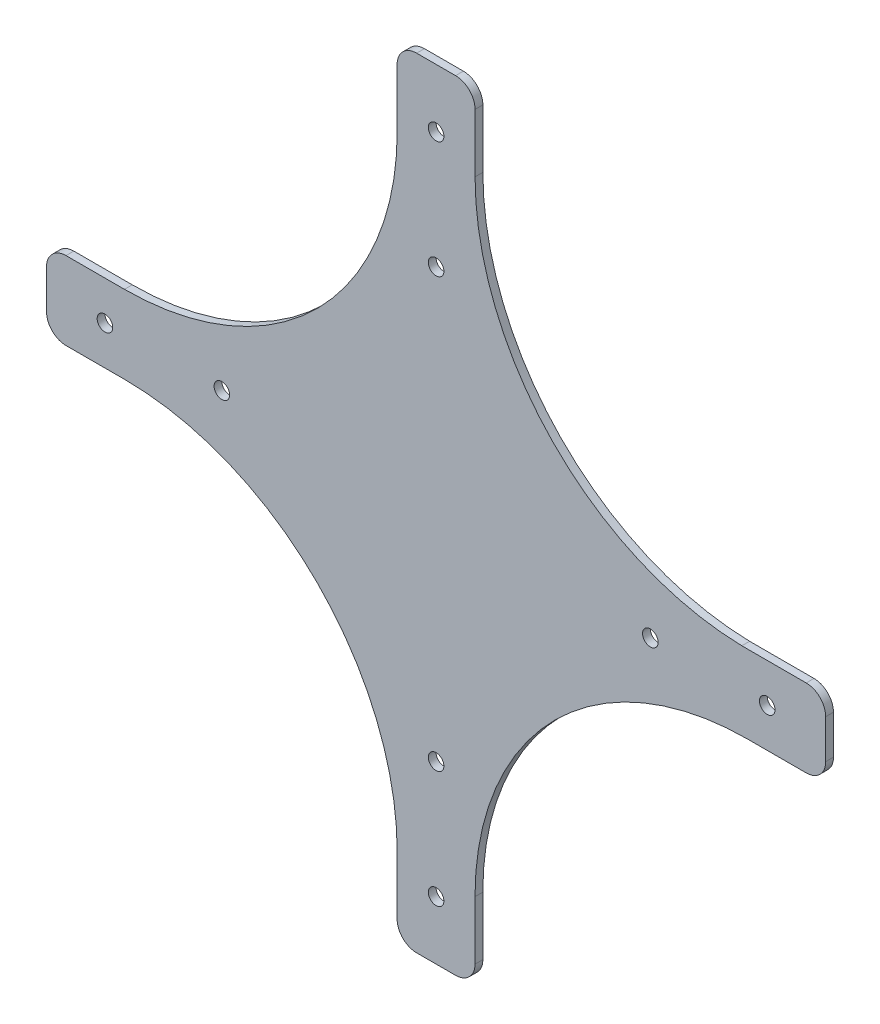
ISO-10303-21;
HEADER;
FILE_DESCRIPTION(('STEP AP214'),'2;1');
FILE_NAME('part.step','',(''),(''),'','','');
FILE_SCHEMA(('AUTOMOTIVE_DESIGN { 1 0 10303 214 1 1 1 1 }'));
ENDSEC;
DATA;
#1=APPLICATION_CONTEXT('core data for automotive mechanical design processes');
#2=APPLICATION_PROTOCOL_DEFINITION('international standard','automotive_design',2000,#1);
#3=PRODUCT_CONTEXT('',#1,'mechanical');
#4=PRODUCT('Part','Part','',(#3));
#5=PRODUCT_RELATED_PRODUCT_CATEGORY('part','',(#4));
#6=PRODUCT_DEFINITION_FORMATION('','',#4);
#7=PRODUCT_DEFINITION_CONTEXT('part definition',#1,'design');
#8=PRODUCT_DEFINITION('design','',#6,#7);
#9=PRODUCT_DEFINITION_SHAPE('','',#8);
#10=(LENGTH_UNIT() NAMED_UNIT(*) SI_UNIT(.MILLI.,.METRE.));
#11=(NAMED_UNIT(*) PLANE_ANGLE_UNIT() SI_UNIT($,.RADIAN.));
#12=(NAMED_UNIT(*) SI_UNIT($,.STERADIAN.) SOLID_ANGLE_UNIT());
#13=UNCERTAINTY_MEASURE_WITH_UNIT(LENGTH_MEASURE(1.E-05),#10,'distance_accuracy_value','');
#14=(GEOMETRIC_REPRESENTATION_CONTEXT(3) GLOBAL_UNCERTAINTY_ASSIGNED_CONTEXT((#13)) GLOBAL_UNIT_ASSIGNED_CONTEXT((#10,
#11,#12)) REPRESENTATION_CONTEXT('',''));
#15=CARTESIAN_POINT('',(0.,0.,0.));
#16=DIRECTION('',(0.,0.,1.));
#17=DIRECTION('',(1.,0.,0.));
#18=AXIS2_PLACEMENT_3D('',#15,#16,#17);
#19=CARTESIAN_POINT('',(-1.11472575882883E-12,-133.874093655514,2.));
#20=DIRECTION('',(0.,-1.,0.));
#21=DIRECTION('',(1.,0.,0.));
#22=AXIS2_PLACEMENT_3D('',#19,#20,#21);
#23=PLANE('',#22);
#24=DIRECTION('',(-1.,0.,0.));
#25=VECTOR('',#24,1.);
#26=CARTESIAN_POINT('',(-1.11472575882883E-12,-133.874093655514,0.));
#27=LINE('',#26,#25);
#28=CARTESIAN_POINT('',(74.5986729088794,-133.874093655515,0.));
#29=VERTEX_POINT('',#28);
#30=CARTESIAN_POINT('',(64.5986729088795,-133.874093655514,0.));
#31=VERTEX_POINT('',#30);
#32=EDGE_CURVE('E253',#29,#31,#27,.T.);
#33=ORIENTED_EDGE('',*,*,#32,.F.);
#34=DIRECTION('',(0.,0.,-1.));
#35=VECTOR('',#34,1.);
#36=CARTESIAN_POINT('',(74.5986729088794,-133.874093655515,2.));
#37=LINE('',#36,#35);
#38=CARTESIAN_POINT('',(74.5986729088794,-133.874093655515,2.));
#39=VERTEX_POINT('',#38);
#40=EDGE_CURVE('E11',#39,#29,#37,.T.);
#41=ORIENTED_EDGE('',*,*,#40,.F.);
#42=DIRECTION('',(-1.,0.,0.));
#43=VECTOR('',#42,1.);
#44=CARTESIAN_POINT('',(-1.11472575882883E-12,-133.874093655514,2.));
#45=LINE('',#44,#43);
#46=CARTESIAN_POINT('',(64.5986729088795,-133.874093655514,2.));
#47=VERTEX_POINT('',#46);
#48=EDGE_CURVE('E387',#39,#47,#45,.T.);
#49=ORIENTED_EDGE('',*,*,#48,.T.);
#50=DIRECTION('',(0.,0.,-1.));
#51=VECTOR('',#50,1.);
#52=CARTESIAN_POINT('',(64.5986729088795,-133.874093655514,2.));
#53=LINE('',#52,#51);
#54=EDGE_CURVE('E135',#47,#31,#53,.T.);
#55=ORIENTED_EDGE('',*,*,#54,.T.);
#56=EDGE_LOOP('',(#33,#41,#49,#55));
#57=FACE_BOUND('',#56,.T.);
#58=ADVANCED_FACE('F35',(#57),#23,.T.);
#59=CARTESIAN_POINT('',(74.5986729088795,-128.874093655515,2.));
#60=DIRECTION('',(0.,0.,-1.));
#61=DIRECTION('',(-1.,0.,0.));
#62=AXIS2_PLACEMENT_3D('',#59,#60,#61);
#63=CYLINDRICAL_SURFACE('',#62,4.99999999999999);
#64=CARTESIAN_POINT('',(74.5986729088795,-128.874093655515,0.));
#65=DIRECTION('',(0.,0.,1.));
#66=DIRECTION('',(1.,0.,0.));
#67=AXIS2_PLACEMENT_3D('',#64,#65,#66);
#68=CIRCLE('',#67,4.99999999999999);
#69=CARTESIAN_POINT('',(79.5986729088795,-128.874093655515,0.));
#70=VERTEX_POINT('',#69);
#71=EDGE_CURVE('E255',#29,#70,#68,.T.);
#72=ORIENTED_EDGE('',*,*,#71,.T.);
#73=DIRECTION('',(0.,0.,-1.));
#74=VECTOR('',#73,1.);
#75=CARTESIAN_POINT('',(79.5986729088795,-128.874093655515,2.));
#76=LINE('',#75,#74);
#77=CARTESIAN_POINT('',(79.5986729088795,-128.874093655515,2.));
#78=VERTEX_POINT('',#77);
#79=EDGE_CURVE('E44',#78,#70,#76,.T.);
#80=ORIENTED_EDGE('',*,*,#79,.F.);
#81=CARTESIAN_POINT('',(74.5986729088795,-128.874093655515,2.));
#82=DIRECTION('',(0.,0.,1.));
#83=DIRECTION('',(1.,0.,0.));
#84=AXIS2_PLACEMENT_3D('',#81,#82,#83);
#85=CIRCLE('',#84,4.99999999999999);
#86=EDGE_CURVE('E383',#39,#78,#85,.T.);
#87=ORIENTED_EDGE('',*,*,#86,.F.);
#88=ORIENTED_EDGE('',*,*,#40,.T.);
#89=EDGE_LOOP('',(#72,#80,#87,#88));
#90=FACE_BOUND('',#89,.T.);
#91=ADVANCED_FACE('F372',(#90),#63,.T.);
#92=CARTESIAN_POINT('',(79.4524198975907,0.0901037334350843,2.));
#93=DIRECTION('',(0.99999935695569,0.00113405829061631,0.));
#94=DIRECTION('',(-0.00113405829061631,0.99999935695569,0.));
#95=AXIS2_PLACEMENT_3D('',#92,#93,#94);
#96=PLANE('',#95);
#97=DIRECTION('',(0.00113405829061631,-0.99999935695569,0.));
#98=VECTOR('',#97,1.);
#99=CARTESIAN_POINT('',(79.4524198975907,0.0901037334350843,0.));
#100=LINE('',#99,#98);
#101=CARTESIAN_POINT('',(79.5816812930767,-113.891085271318,0.));
#102=VERTEX_POINT('',#101);
#103=EDGE_CURVE('E258',#102,#70,#100,.T.);
#104=ORIENTED_EDGE('',*,*,#103,.F.);
#105=DIRECTION('',(0.,0.,-1.));
#106=VECTOR('',#105,1.);
#107=CARTESIAN_POINT('',(79.5816812930767,-113.891085271318,2.));
#108=LINE('',#107,#106);
#109=CARTESIAN_POINT('',(79.5816812930767,-113.891085271318,2.));
#110=VERTEX_POINT('',#109);
#111=EDGE_CURVE('E362',#110,#102,#108,.T.);
#112=ORIENTED_EDGE('',*,*,#111,.F.);
#113=DIRECTION('',(0.00113405829061631,-0.99999935695569,0.));
#114=VECTOR('',#113,1.);
#115=CARTESIAN_POINT('',(79.4524198975907,0.0901037334350843,2.));
#116=LINE('',#115,#114);
#117=EDGE_CURVE('E369',#110,#78,#116,.T.);
#118=ORIENTED_EDGE('',*,*,#117,.T.);
#119=ORIENTED_EDGE('',*,*,#79,.T.);
#120=EDGE_LOOP('',(#104,#112,#118,#119));
#121=FACE_BOUND('',#120,.T.);
#122=ADVANCED_FACE('F367',(#121),#96,.T.);
#123=CARTESIAN_POINT('',(149.581681293077,-113.891085271318,2.));
#124=DIRECTION('',(0.,0.,-1.));
#125=DIRECTION('',(-1.,0.,0.));
#126=AXIS2_PLACEMENT_3D('',#123,#124,#125);
#127=CYLINDRICAL_SURFACE('',#126,70.);
#128=CARTESIAN_POINT('',(149.581681293077,-113.891085271318,0.));
#129=DIRECTION('',(0.,0.,1.));
#130=DIRECTION('',(1.,0.,0.));
#131=AXIS2_PLACEMENT_3D('',#128,#129,#130);
#132=CIRCLE('',#131,70.);
#133=CARTESIAN_POINT('',(149.581681293078,-43.8910852713184,0.));
#134=VERTEX_POINT('',#133);
#135=EDGE_CURVE('E261',#134,#102,#132,.T.);
#136=ORIENTED_EDGE('',*,*,#135,.F.);
#137=DIRECTION('',(0.,0.,-1.));
#138=VECTOR('',#137,1.);
#139=CARTESIAN_POINT('',(149.581681293078,-43.8910852713184,2.));
#140=LINE('',#139,#138);
#141=CARTESIAN_POINT('',(149.581681293078,-43.8910852713184,2.));
#142=VERTEX_POINT('',#141);
#143=EDGE_CURVE('E360',#142,#134,#140,.T.);
#144=ORIENTED_EDGE('',*,*,#143,.F.);
#145=CARTESIAN_POINT('',(149.581681293077,-113.891085271318,2.));
#146=DIRECTION('',(0.,0.,1.));
#147=DIRECTION('',(1.,0.,0.));
#148=AXIS2_PLACEMENT_3D('',#145,#146,#147);
#149=CIRCLE('',#148,70.);
#150=EDGE_CURVE('E381',#142,#110,#149,.T.);
#151=ORIENTED_EDGE('',*,*,#150,.T.);
#152=ORIENTED_EDGE('',*,*,#111,.T.);
#153=EDGE_LOOP('',(#136,#144,#151,#152));
#154=FACE_BOUND('',#153,.T.);
#155=ADVANCED_FACE('F377',(#154),#127,.F.);
#156=CARTESIAN_POINT('',(-3.04555584025027E-13,-43.8910852713173,2.));
#157=DIRECTION('',(0.,1.,0.));
#158=DIRECTION('',(-1.,0.,0.));
#159=AXIS2_PLACEMENT_3D('',#156,#157,#158);
#160=PLANE('',#159);
#161=DIRECTION('',(1.,0.,0.));
#162=VECTOR('',#161,1.);
#163=CARTESIAN_POINT('',(-3.04555584025027E-13,-43.8910852713173,0.));
#164=LINE('',#163,#162);
#165=CARTESIAN_POINT('',(164.581681293077,-43.8910852713185,0.));
#166=VERTEX_POINT('',#165);
#167=EDGE_CURVE('E264',#134,#166,#164,.T.);
#168=ORIENTED_EDGE('',*,*,#167,.T.);
#169=DIRECTION('',(0.,0.,-1.));
#170=VECTOR('',#169,1.);
#171=CARTESIAN_POINT('',(164.581681293077,-43.8910852713185,2.));
#172=LINE('',#171,#170);
#173=CARTESIAN_POINT('',(164.581681293077,-43.8910852713185,2.));
#174=VERTEX_POINT('',#173);
#175=EDGE_CURVE('E357',#174,#166,#172,.T.);
#176=ORIENTED_EDGE('',*,*,#175,.F.);
#177=DIRECTION('',(1.,0.,0.));
#178=VECTOR('',#177,1.);
#179=CARTESIAN_POINT('',(-3.04555584025027E-13,-43.8910852713173,2.));
#180=LINE('',#179,#178);
#181=EDGE_CURVE('E385',#142,#174,#180,.T.);
#182=ORIENTED_EDGE('',*,*,#181,.F.);
#183=ORIENTED_EDGE('',*,*,#143,.T.);
#184=EDGE_LOOP('',(#168,#176,#182,#183));
#185=FACE_BOUND('',#184,.T.);
#186=ADVANCED_FACE('F492',(#185),#160,.F.);
#187=CARTESIAN_POINT('',(164.581681293077,-38.8910852713185,2.));
#188=DIRECTION('',(0.,0.,-1.));
#189=DIRECTION('',(-1.,0.,0.));
#190=AXIS2_PLACEMENT_3D('',#187,#188,#189);
#191=CYLINDRICAL_SURFACE('',#190,5.);
#192=CARTESIAN_POINT('',(164.581681293077,-38.8910852713185,0.));
#193=DIRECTION('',(0.,0.,1.));
#194=DIRECTION('',(1.,0.,0.));
#195=AXIS2_PLACEMENT_3D('',#192,#193,#194);
#196=CIRCLE('',#195,5.);
#197=CARTESIAN_POINT('',(169.581681293077,-38.8910852713185,0.));
#198=VERTEX_POINT('',#197);
#199=EDGE_CURVE('E267',#166,#198,#196,.T.);
#200=ORIENTED_EDGE('',*,*,#199,.T.);
#201=DIRECTION('',(0.,0.,-1.));
#202=VECTOR('',#201,1.);
#203=CARTESIAN_POINT('',(169.581681293077,-38.8910852713185,2.));
#204=LINE('',#203,#202);
#205=CARTESIAN_POINT('',(169.581681293077,-38.8910852713185,2.));
#206=VERTEX_POINT('',#205);
#207=EDGE_CURVE('E355',#206,#198,#204,.T.);
#208=ORIENTED_EDGE('',*,*,#207,.F.);
#209=CARTESIAN_POINT('',(164.581681293077,-38.8910852713185,2.));
#210=DIRECTION('',(0.,0.,1.));
#211=DIRECTION('',(1.,0.,0.));
#212=AXIS2_PLACEMENT_3D('',#209,#210,#211);
#213=CIRCLE('',#212,5.);
#214=EDGE_CURVE('E392',#174,#206,#213,.T.);
#215=ORIENTED_EDGE('',*,*,#214,.F.);
#216=ORIENTED_EDGE('',*,*,#175,.T.);
#217=EDGE_LOOP('',(#200,#208,#215,#216));
#218=FACE_BOUND('',#217,.T.);
#219=ADVANCED_FACE('F490',(#218),#191,.T.);
#220=CARTESIAN_POINT('',(169.581681293077,-1.41205115344666E-12,2.));
#221=DIRECTION('',(1.,0.,0.));
#222=DIRECTION('',(0.,1.,0.));
#223=AXIS2_PLACEMENT_3D('',#220,#221,#222);
#224=PLANE('',#223);
#225=DIRECTION('',(0.,-1.,0.));
#226=VECTOR('',#225,1.);
#227=CARTESIAN_POINT('',(169.581681293077,-1.41205115344666E-12,0.));
#228=LINE('',#227,#226);
#229=CARTESIAN_POINT('',(169.581681293077,-28.8910852713186,0.));
#230=VERTEX_POINT('',#229);
#231=EDGE_CURVE('E270',#230,#198,#228,.T.);
#232=ORIENTED_EDGE('',*,*,#231,.F.);
#233=DIRECTION('',(0.,0.,-1.));
#234=VECTOR('',#233,1.);
#235=CARTESIAN_POINT('',(169.581681293077,-28.8910852713186,2.));
#236=LINE('',#235,#234);
#237=CARTESIAN_POINT('',(169.581681293077,-28.8910852713186,2.));
#238=VERTEX_POINT('',#237);
#239=EDGE_CURVE('E353',#238,#230,#236,.T.);
#240=ORIENTED_EDGE('',*,*,#239,.F.);
#241=DIRECTION('',(0.,-1.,0.));
#242=VECTOR('',#241,1.);
#243=CARTESIAN_POINT('',(169.581681293077,-1.41205115344666E-12,2.));
#244=LINE('',#243,#242);
#245=EDGE_CURVE('E394',#238,#206,#244,.T.);
#246=ORIENTED_EDGE('',*,*,#245,.T.);
#247=ORIENTED_EDGE('',*,*,#207,.T.);
#248=EDGE_LOOP('',(#232,#240,#246,#247));
#249=FACE_BOUND('',#248,.T.);
#250=ADVANCED_FACE('F486',(#249),#224,.T.);
#251=CARTESIAN_POINT('',(164.581681293077,-28.8910852713185,2.));
#252=DIRECTION('',(0.,0.,-1.));
#253=DIRECTION('',(-1.,0.,0.));
#254=AXIS2_PLACEMENT_3D('',#251,#252,#253);
#255=CYLINDRICAL_SURFACE('',#254,5.);
#256=CARTESIAN_POINT('',(164.581681293077,-28.8910852713185,0.));
#257=DIRECTION('',(0.,0.,1.));
#258=DIRECTION('',(1.,0.,0.));
#259=AXIS2_PLACEMENT_3D('',#256,#257,#258);
#260=CIRCLE('',#259,5.);
#261=CARTESIAN_POINT('',(164.581681293077,-23.8910852713185,0.));
#262=VERTEX_POINT('',#261);
#263=EDGE_CURVE('E273',#230,#262,#260,.T.);
#264=ORIENTED_EDGE('',*,*,#263,.T.);
#265=DIRECTION('',(0.,0.,-1.));
#266=VECTOR('',#265,1.);
#267=CARTESIAN_POINT('',(164.581681293077,-23.8910852713185,2.));
#268=LINE('',#267,#266);
#269=CARTESIAN_POINT('',(164.581681293077,-23.8910852713185,2.));
#270=VERTEX_POINT('',#269);
#271=EDGE_CURVE('E351',#270,#262,#268,.T.);
#272=ORIENTED_EDGE('',*,*,#271,.F.);
#273=CARTESIAN_POINT('',(164.581681293077,-28.8910852713185,2.));
#274=DIRECTION('',(0.,0.,1.));
#275=DIRECTION('',(1.,0.,0.));
#276=AXIS2_PLACEMENT_3D('',#273,#274,#275);
#277=CIRCLE('',#276,5.);
#278=EDGE_CURVE('E397',#238,#270,#277,.T.);
#279=ORIENTED_EDGE('',*,*,#278,.F.);
#280=ORIENTED_EDGE('',*,*,#239,.T.);
#281=EDGE_LOOP('',(#264,#272,#279,#280));
#282=FACE_BOUND('',#281,.T.);
#283=ADVANCED_FACE('F483',(#282),#255,.T.);
#284=CARTESIAN_POINT('',(-9.22923434173048E-13,-23.8910852713121,2.));
#285=DIRECTION('',(0.,1.,0.));
#286=DIRECTION('',(-1.,0.,0.));
#287=AXIS2_PLACEMENT_3D('',#284,#285,#286);
#288=PLANE('',#287);
#289=DIRECTION('',(1.,0.,0.));
#290=VECTOR('',#289,1.);
#291=CARTESIAN_POINT('',(-9.22923434173048E-13,-23.8910852713121,0.));
#292=LINE('',#291,#290);
#293=CARTESIAN_POINT('',(148.056422119466,-23.8910852713178,0.));
#294=VERTEX_POINT('',#293);
#295=EDGE_CURVE('E276',#294,#262,#292,.T.);
#296=ORIENTED_EDGE('',*,*,#295,.F.);
#297=DIRECTION('',(0.,0.,-1.));
#298=VECTOR('',#297,1.);
#299=CARTESIAN_POINT('',(148.056422119466,-23.8910852713178,2.));
#300=LINE('',#299,#298);
#301=CARTESIAN_POINT('',(148.056422119466,-23.8910852713178,2.));
#302=VERTEX_POINT('',#301);
#303=EDGE_CURVE('E349',#302,#294,#300,.T.);
#304=ORIENTED_EDGE('',*,*,#303,.F.);
#305=DIRECTION('',(1.,0.,0.));
#306=VECTOR('',#305,1.);
#307=CARTESIAN_POINT('',(-9.22923434173048E-13,-23.8910852713121,2.));
#308=LINE('',#307,#306);
#309=EDGE_CURVE('E399',#302,#270,#308,.T.);
#310=ORIENTED_EDGE('',*,*,#309,.T.);
#311=ORIENTED_EDGE('',*,*,#271,.T.);
#312=EDGE_LOOP('',(#296,#304,#310,#311));
#313=FACE_BOUND('',#312,.T.);
#314=ADVANCED_FACE('F478',(#313),#288,.T.);
#315=CARTESIAN_POINT('',(149.598672908881,46.0919231128786,2.));
#316=DIRECTION('',(0.,0.,-1.));
#317=DIRECTION('',(-1.,0.,0.));
#318=AXIS2_PLACEMENT_3D('',#315,#316,#317);
#319=CYLINDRICAL_SURFACE('',#318,70.);
#320=CARTESIAN_POINT('',(149.598672908881,46.0919231128786,0.));
#321=DIRECTION('',(0.,0.,1.));
#322=DIRECTION('',(1.,0.,0.));
#323=AXIS2_PLACEMENT_3D('',#320,#321,#322);
#324=CIRCLE('',#323,70.);
#325=CARTESIAN_POINT('',(79.5986729088808,46.0919231128793,0.));
#326=VERTEX_POINT('',#325);
#327=EDGE_CURVE('E279',#326,#294,#324,.T.);
#328=ORIENTED_EDGE('',*,*,#327,.F.);
#329=DIRECTION('',(0.,0.,-1.));
#330=VECTOR('',#329,1.);
#331=CARTESIAN_POINT('',(79.5986729088808,46.0919231128793,2.));
#332=LINE('',#331,#330);
#333=CARTESIAN_POINT('',(79.5986729088808,46.0919231128793,2.));
#334=VERTEX_POINT('',#333);
#335=EDGE_CURVE('E347',#334,#326,#332,.T.);
#336=ORIENTED_EDGE('',*,*,#335,.F.);
#337=CARTESIAN_POINT('',(149.598672908881,46.0919231128786,2.));
#338=DIRECTION('',(0.,0.,1.));
#339=DIRECTION('',(1.,0.,0.));
#340=AXIS2_PLACEMENT_3D('',#337,#338,#339);
#341=CIRCLE('',#340,70.);
#342=EDGE_CURVE('E402',#334,#302,#341,.T.);
#343=ORIENTED_EDGE('',*,*,#342,.T.);
#344=ORIENTED_EDGE('',*,*,#303,.T.);
#345=EDGE_LOOP('',(#328,#336,#343,#344));
#346=FACE_BOUND('',#345,.T.);
#347=ADVANCED_FACE('F473',(#346),#319,.F.);
#348=CARTESIAN_POINT('',(79.5986729088806,-2.94574264643497E-13,2.));
#349=DIRECTION('',(1.,0.,0.));
#350=DIRECTION('',(0.,1.,0.));
#351=AXIS2_PLACEMENT_3D('',#348,#349,#350);
#352=PLANE('',#351);
#353=DIRECTION('',(0.,-1.,0.));
#354=VECTOR('',#353,1.);
#355=CARTESIAN_POINT('',(79.5986729088806,-2.94574264643497E-13,0.));
#356=LINE('',#355,#354);
#357=CARTESIAN_POINT('',(79.5986729088808,61.0919231128788,0.));
#358=VERTEX_POINT('',#357);
#359=EDGE_CURVE('E282',#358,#326,#356,.T.);
#360=ORIENTED_EDGE('',*,*,#359,.F.);
#361=DIRECTION('',(0.,0.,-1.));
#362=VECTOR('',#361,1.);
#363=CARTESIAN_POINT('',(79.5986729088808,61.0919231128788,2.));
#364=LINE('',#363,#362);
#365=CARTESIAN_POINT('',(79.5986729088808,61.0919231128788,2.));
#366=VERTEX_POINT('',#365);
#367=EDGE_CURVE('E345',#366,#358,#364,.T.);
#368=ORIENTED_EDGE('',*,*,#367,.F.);
#369=DIRECTION('',(0.,-1.,0.));
#370=VECTOR('',#369,1.);
#371=CARTESIAN_POINT('',(79.5986729088806,-2.94574264643497E-13,2.));
#372=LINE('',#371,#370);
#373=EDGE_CURVE('E405',#366,#334,#372,.T.);
#374=ORIENTED_EDGE('',*,*,#373,.T.);
#375=ORIENTED_EDGE('',*,*,#335,.T.);
#376=EDGE_LOOP('',(#360,#368,#374,#375));
#377=FACE_BOUND('',#376,.T.);
#378=ADVANCED_FACE('F467',(#377),#352,.T.);
#379=CARTESIAN_POINT('',(74.5986729088808,61.0919231128788,2.));
#380=DIRECTION('',(0.,0.,-1.));
#381=DIRECTION('',(-1.,0.,0.));
#382=AXIS2_PLACEMENT_3D('',#379,#380,#381);
#383=CYLINDRICAL_SURFACE('',#382,5.);
#384=CARTESIAN_POINT('',(74.5986729088808,61.0919231128788,0.));
#385=DIRECTION('',(0.,0.,1.));
#386=DIRECTION('',(1.,0.,0.));
#387=AXIS2_PLACEMENT_3D('',#384,#385,#386);
#388=CIRCLE('',#387,5.);
#389=CARTESIAN_POINT('',(74.5986729088808,66.0919231128788,0.));
#390=VERTEX_POINT('',#389);
#391=EDGE_CURVE('E285',#358,#390,#388,.T.);
#392=ORIENTED_EDGE('',*,*,#391,.T.);
#393=DIRECTION('',(0.,0.,-1.));
#394=VECTOR('',#393,1.);
#395=CARTESIAN_POINT('',(74.5986729088808,66.0919231128788,2.));
#396=LINE('',#395,#394);
#397=CARTESIAN_POINT('',(74.5986729088808,66.0919231128788,2.));
#398=VERTEX_POINT('',#397);
#399=EDGE_CURVE('E343',#398,#390,#396,.T.);
#400=ORIENTED_EDGE('',*,*,#399,.F.);
#401=CARTESIAN_POINT('',(74.5986729088808,61.0919231128788,2.));
#402=DIRECTION('',(0.,0.,1.));
#403=DIRECTION('',(1.,0.,0.));
#404=AXIS2_PLACEMENT_3D('',#401,#402,#403);
#405=CIRCLE('',#404,5.);
#406=EDGE_CURVE('E408',#366,#398,#405,.T.);
#407=ORIENTED_EDGE('',*,*,#406,.F.);
#408=ORIENTED_EDGE('',*,*,#367,.T.);
#409=EDGE_LOOP('',(#392,#400,#407,#408));
#410=FACE_BOUND('',#409,.T.);
#411=ADVANCED_FACE('F493',(#410),#383,.T.);
#412=CARTESIAN_POINT('',(1.83441936954186E-13,66.091923112879,2.));
#413=DIRECTION('',(0.,1.,0.));
#414=DIRECTION('',(-1.,0.,0.));
#415=AXIS2_PLACEMENT_3D('',#412,#413,#414);
#416=PLANE('',#415);
#417=DIRECTION('',(1.,0.,0.));
#418=VECTOR('',#417,1.);
#419=CARTESIAN_POINT('',(1.83441936954186E-13,66.091923112879,0.));
#420=LINE('',#419,#418);
#421=CARTESIAN_POINT('',(64.5986729088809,66.0919231128788,0.));
#422=VERTEX_POINT('',#421);
#423=EDGE_CURVE('E288',#422,#390,#420,.T.);
#424=ORIENTED_EDGE('',*,*,#423,.F.);
#425=DIRECTION('',(0.,0.,-1.));
#426=VECTOR('',#425,1.);
#427=CARTESIAN_POINT('',(64.5986729088809,66.0919231128788,2.));
#428=LINE('',#427,#426);
#429=CARTESIAN_POINT('',(64.5986729088809,66.0919231128788,2.));
#430=VERTEX_POINT('',#429);
#431=EDGE_CURVE('E341',#430,#422,#428,.T.);
#432=ORIENTED_EDGE('',*,*,#431,.F.);
#433=DIRECTION('',(1.,0.,0.));
#434=VECTOR('',#433,1.);
#435=CARTESIAN_POINT('',(1.83441936954186E-13,66.091923112879,2.));
#436=LINE('',#435,#434);
#437=EDGE_CURVE('E410',#430,#398,#436,.T.);
#438=ORIENTED_EDGE('',*,*,#437,.T.);
#439=ORIENTED_EDGE('',*,*,#399,.T.);
#440=EDGE_LOOP('',(#424,#432,#438,#439));
#441=FACE_BOUND('',#440,.T.);
#442=ADVANCED_FACE('F461',(#441),#416,.T.);
#443=CARTESIAN_POINT('',(64.5986729088808,61.0919231128789,2.));
#444=DIRECTION('',(0.,0.,-1.));
#445=DIRECTION('',(-1.,0.,0.));
#446=AXIS2_PLACEMENT_3D('',#443,#444,#445);
#447=CYLINDRICAL_SURFACE('',#446,5.);
#448=CARTESIAN_POINT('',(64.5986729088808,61.0919231128789,0.));
#449=DIRECTION('',(0.,0.,1.));
#450=DIRECTION('',(1.,0.,0.));
#451=AXIS2_PLACEMENT_3D('',#448,#449,#450);
#452=CIRCLE('',#451,5.);
#453=CARTESIAN_POINT('',(59.6156645246838,61.503781635949,0.));
#454=VERTEX_POINT('',#453);
#455=EDGE_CURVE('E291',#422,#454,#452,.T.);
#456=ORIENTED_EDGE('',*,*,#455,.T.);
#457=DIRECTION('',(0.,0.,-1.));
#458=VECTOR('',#457,1.);
#459=CARTESIAN_POINT('',(59.6156645246838,61.503781635949,2.));
#460=LINE('',#459,#458);
#461=CARTESIAN_POINT('',(59.6156645246838,61.503781635949,2.));
#462=VERTEX_POINT('',#461);
#463=EDGE_CURVE('E338',#462,#454,#460,.T.);
#464=ORIENTED_EDGE('',*,*,#463,.F.);
#465=CARTESIAN_POINT('',(64.5986729088808,61.0919231128789,2.));
#466=DIRECTION('',(0.,0.,1.));
#467=DIRECTION('',(1.,0.,0.));
#468=AXIS2_PLACEMENT_3D('',#465,#466,#467);
#469=CIRCLE('',#468,5.);
#470=EDGE_CURVE('E413',#430,#462,#469,.T.);
#471=ORIENTED_EDGE('',*,*,#470,.F.);
#472=ORIENTED_EDGE('',*,*,#431,.T.);
#473=EDGE_LOOP('',(#456,#464,#471,#472));
#474=FACE_BOUND('',#473,.T.);
#475=ADVANCED_FACE('F458',(#474),#447,.T.);
#476=CARTESIAN_POINT('',(59.6156645246838,0.,2.));
#477=DIRECTION('',(1.,0.,0.));
#478=DIRECTION('',(0.,0.,-1.));
#479=AXIS2_PLACEMENT_3D('',#476,#477,#478);
#480=PLANE('',#479);
#481=DIRECTION('',(0.,-1.,0.));
#482=VECTOR('',#481,1.);
#483=CARTESIAN_POINT('',(59.6156645246838,0.,0.));
#484=LINE('',#483,#482);
#485=CARTESIAN_POINT('',(59.6156645246838,46.1089147286827,0.));
#486=VERTEX_POINT('',#485);
#487=EDGE_CURVE('E294',#454,#486,#484,.T.);
#488=ORIENTED_EDGE('',*,*,#487,.T.);
#489=DIRECTION('',(0.,0.,-1.));
#490=VECTOR('',#489,1.);
#491=CARTESIAN_POINT('',(59.6156645246838,46.1089147286827,2.));
#492=LINE('',#491,#490);
#493=CARTESIAN_POINT('',(59.6156645246838,46.1089147286827,2.));
#494=VERTEX_POINT('',#493);
#495=EDGE_CURVE('E336',#494,#486,#492,.T.);
#496=ORIENTED_EDGE('',*,*,#495,.F.);
#497=DIRECTION('',(0.,-1.,0.));
#498=VECTOR('',#497,1.);
#499=CARTESIAN_POINT('',(59.6156645246838,0.,2.));
#500=LINE('',#499,#498);
#501=EDGE_CURVE('E416',#462,#494,#500,.T.);
#502=ORIENTED_EDGE('',*,*,#501,.F.);
#503=ORIENTED_EDGE('',*,*,#463,.T.);
#504=EDGE_LOOP('',(#488,#496,#502,#503));
#505=FACE_BOUND('',#504,.T.);
#506=ADVANCED_FACE('F455',(#505),#480,.F.);
#507=CARTESIAN_POINT('',(-10.3843354753162,46.1089147286822,2.));
#508=DIRECTION('',(0.,0.,-1.));
#509=DIRECTION('',(-1.,0.,0.));
#510=AXIS2_PLACEMENT_3D('',#507,#508,#509);
#511=CYLINDRICAL_SURFACE('',#510,70.);
#512=CARTESIAN_POINT('',(-10.3843354753162,46.1089147286822,0.));
#513=DIRECTION('',(0.,0.,1.));
#514=DIRECTION('',(1.,0.,0.));
#515=AXIS2_PLACEMENT_3D('',#512,#513,#514);
#516=CIRCLE('',#515,70.);
#517=CARTESIAN_POINT('',(-10.3843354753167,-23.8910852713178,0.));
#518=VERTEX_POINT('',#517);
#519=EDGE_CURVE('E297',#518,#486,#516,.T.);
#520=ORIENTED_EDGE('',*,*,#519,.F.);
#521=DIRECTION('',(0.,0.,-1.));
#522=VECTOR('',#521,1.);
#523=CARTESIAN_POINT('',(-10.3843354753167,-23.8910852713178,2.));
#524=LINE('',#523,#522);
#525=CARTESIAN_POINT('',(-10.3843354753167,-23.8910852713178,2.));
#526=VERTEX_POINT('',#525);
#527=EDGE_CURVE('E334',#526,#518,#524,.T.);
#528=ORIENTED_EDGE('',*,*,#527,.F.);
#529=CARTESIAN_POINT('',(-10.3843354753162,46.1089147286822,2.));
#530=DIRECTION('',(0.,0.,1.));
#531=DIRECTION('',(1.,0.,0.));
#532=AXIS2_PLACEMENT_3D('',#529,#530,#531);
#533=CIRCLE('',#532,70.);
#534=EDGE_CURVE('E418',#526,#494,#533,.T.);
#535=ORIENTED_EDGE('',*,*,#534,.T.);
#536=ORIENTED_EDGE('',*,*,#495,.T.);
#537=EDGE_LOOP('',(#520,#528,#535,#536));
#538=FACE_BOUND('',#537,.T.);
#539=ADVANCED_FACE('F449',(#538),#511,.F.);
#540=CARTESIAN_POINT('',(0.,-23.8910852713178,2.));
#541=DIRECTION('',(0.,1.,0.));
#542=DIRECTION('',(0.,0.,1.));
#543=AXIS2_PLACEMENT_3D('',#540,#541,#542);
#544=PLANE('',#543);
#545=DIRECTION('',(1.,0.,0.));
#546=VECTOR('',#545,1.);
#547=CARTESIAN_POINT('',(0.,-23.8910852713178,0.));
#548=LINE('',#547,#546);
#549=CARTESIAN_POINT('',(-25.3843354753162,-23.8910852713178,0.));
#550=VERTEX_POINT('',#549);
#551=EDGE_CURVE('E300',#550,#518,#548,.T.);
#552=ORIENTED_EDGE('',*,*,#551,.F.);
#553=DIRECTION('',(0.,0.,-1.));
#554=VECTOR('',#553,1.);
#555=CARTESIAN_POINT('',(-25.3843354753162,-23.8910852713178,2.));
#556=LINE('',#555,#554);
#557=CARTESIAN_POINT('',(-25.3843354753162,-23.8910852713178,2.));
#558=VERTEX_POINT('',#557);
#559=EDGE_CURVE('E332',#558,#550,#556,.T.);
#560=ORIENTED_EDGE('',*,*,#559,.F.);
#561=DIRECTION('',(1.,0.,0.));
#562=VECTOR('',#561,1.);
#563=CARTESIAN_POINT('',(0.,-23.8910852713178,2.));
#564=LINE('',#563,#562);
#565=EDGE_CURVE('E421',#558,#526,#564,.T.);
#566=ORIENTED_EDGE('',*,*,#565,.T.);
#567=ORIENTED_EDGE('',*,*,#527,.T.);
#568=EDGE_LOOP('',(#552,#560,#566,#567));
#569=FACE_BOUND('',#568,.T.);
#570=ADVANCED_FACE('F444',(#569),#544,.T.);
#571=CARTESIAN_POINT('',(-25.3843354753162,-28.8910852713178,2.));
#572=DIRECTION('',(0.,0.,-1.));
#573=DIRECTION('',(-1.,0.,0.));
#574=AXIS2_PLACEMENT_3D('',#571,#572,#573);
#575=CYLINDRICAL_SURFACE('',#574,5.);
#576=CARTESIAN_POINT('',(-25.3843354753162,-28.8910852713178,0.));
#577=DIRECTION('',(0.,0.,1.));
#578=DIRECTION('',(1.,0.,0.));
#579=AXIS2_PLACEMENT_3D('',#576,#577,#578);
#580=CIRCLE('',#579,5.);
#581=CARTESIAN_POINT('',(-30.3843354753162,-28.8910852713179,0.));
#582=VERTEX_POINT('',#581);
#583=EDGE_CURVE('E303',#550,#582,#580,.T.);
#584=ORIENTED_EDGE('',*,*,#583,.T.);
#585=DIRECTION('',(0.,0.,-1.));
#586=VECTOR('',#585,1.);
#587=CARTESIAN_POINT('',(-30.3843354753162,-28.8910852713179,2.));
#588=LINE('',#587,#586);
#589=CARTESIAN_POINT('',(-30.3843354753162,-28.8910852713179,2.));
#590=VERTEX_POINT('',#589);
#591=EDGE_CURVE('E329',#590,#582,#588,.T.);
#592=ORIENTED_EDGE('',*,*,#591,.F.);
#593=CARTESIAN_POINT('',(-25.3843354753162,-28.8910852713178,2.));
#594=DIRECTION('',(0.,0.,1.));
#595=DIRECTION('',(1.,0.,0.));
#596=AXIS2_PLACEMENT_3D('',#593,#594,#595);
#597=CIRCLE('',#596,5.);
#598=EDGE_CURVE('E424',#558,#590,#597,.T.);
#599=ORIENTED_EDGE('',*,*,#598,.F.);
#600=ORIENTED_EDGE('',*,*,#559,.T.);
#601=EDGE_LOOP('',(#584,#592,#599,#600));
#602=FACE_BOUND('',#601,.T.);
#603=ADVANCED_FACE('F441',(#602),#575,.T.);
#604=CARTESIAN_POINT('',(-30.3843354753162,0.,2.));
#605=DIRECTION('',(1.,0.,0.));
#606=DIRECTION('',(0.,1.,0.));
#607=AXIS2_PLACEMENT_3D('',#604,#605,#606);
#608=PLANE('',#607);
#609=DIRECTION('',(0.,-1.,0.));
#610=VECTOR('',#609,1.);
#611=CARTESIAN_POINT('',(-30.3843354753162,0.,0.));
#612=LINE('',#611,#610);
#613=CARTESIAN_POINT('',(-30.3843354753162,-38.8910852713178,0.));
#614=VERTEX_POINT('',#613);
#615=EDGE_CURVE('E306',#582,#614,#612,.T.);
#616=ORIENTED_EDGE('',*,*,#615,.T.);
#617=DIRECTION('',(0.,0.,-1.));
#618=VECTOR('',#617,1.);
#619=CARTESIAN_POINT('',(-30.3843354753162,-38.8910852713178,2.));
#620=LINE('',#619,#618);
#621=CARTESIAN_POINT('',(-30.3843354753162,-38.8910852713178,2.));
#622=VERTEX_POINT('',#621);
#623=EDGE_CURVE('E326',#622,#614,#620,.T.);
#624=ORIENTED_EDGE('',*,*,#623,.F.);
#625=DIRECTION('',(0.,-1.,0.));
#626=VECTOR('',#625,1.);
#627=CARTESIAN_POINT('',(-30.3843354753162,0.,2.));
#628=LINE('',#627,#626);
#629=EDGE_CURVE('E427',#590,#622,#628,.T.);
#630=ORIENTED_EDGE('',*,*,#629,.F.);
#631=ORIENTED_EDGE('',*,*,#591,.T.);
#632=EDGE_LOOP('',(#616,#624,#630,#631));
#633=FACE_BOUND('',#632,.T.);
#634=ADVANCED_FACE('F437',(#633),#608,.F.);
#635=CARTESIAN_POINT('',(-25.3843354753162,-38.8910852713178,2.));
#636=DIRECTION('',(0.,0.,-1.));
#637=DIRECTION('',(-1.,0.,0.));
#638=AXIS2_PLACEMENT_3D('',#635,#636,#637);
#639=CYLINDRICAL_SURFACE('',#638,5.);
#640=CARTESIAN_POINT('',(-25.3843354753162,-38.8910852713178,0.));
#641=DIRECTION('',(0.,0.,1.));
#642=DIRECTION('',(1.,0.,0.));
#643=AXIS2_PLACEMENT_3D('',#640,#641,#642);
#644=CIRCLE('',#643,5.);
#645=CARTESIAN_POINT('',(-25.3843354753161,-43.8910852713178,0.));
#646=VERTEX_POINT('',#645);
#647=EDGE_CURVE('E309',#614,#646,#644,.T.);
#648=ORIENTED_EDGE('',*,*,#647,.T.);
#649=DIRECTION('',(0.,0.,-1.));
#650=VECTOR('',#649,1.);
#651=CARTESIAN_POINT('',(-25.3843354753161,-43.8910852713178,2.));
#652=LINE('',#651,#650);
#653=CARTESIAN_POINT('',(-25.3843354753161,-43.8910852713178,2.));
#654=VERTEX_POINT('',#653);
#655=EDGE_CURVE('E323',#654,#646,#652,.T.);
#656=ORIENTED_EDGE('',*,*,#655,.F.);
#657=CARTESIAN_POINT('',(-25.3843354753162,-38.8910852713178,2.));
#658=DIRECTION('',(0.,0.,1.));
#659=DIRECTION('',(1.,0.,0.));
#660=AXIS2_PLACEMENT_3D('',#657,#658,#659);
#661=CIRCLE('',#660,5.);
#662=EDGE_CURVE('E224',#622,#654,#661,.T.);
#663=ORIENTED_EDGE('',*,*,#662,.F.);
#664=ORIENTED_EDGE('',*,*,#623,.T.);
#665=EDGE_LOOP('',(#648,#656,#663,#664));
#666=FACE_BOUND('',#665,.T.);
#667=ADVANCED_FACE('F432',(#666),#639,.T.);
#668=CARTESIAN_POINT('',(0.,-43.8910852713178,2.));
#669=DIRECTION('',(0.,1.,0.));
#670=DIRECTION('',(0.,0.,1.));
#671=AXIS2_PLACEMENT_3D('',#668,#669,#670);
#672=PLANE('',#671);
#673=DIRECTION('',(1.,0.,0.));
#674=VECTOR('',#673,1.);
#675=CARTESIAN_POINT('',(0.,-43.8910852713178,0.));
#676=LINE('',#675,#674);
#677=CARTESIAN_POINT('',(-10.3843354753167,-43.8910852713178,0.));
#678=VERTEX_POINT('',#677);
#679=EDGE_CURVE('E312',#646,#678,#676,.T.);
#680=ORIENTED_EDGE('',*,*,#679,.T.);
#681=DIRECTION('',(0.,0.,-1.));
#682=VECTOR('',#681,1.);
#683=CARTESIAN_POINT('',(-10.3843354753167,-43.8910852713178,2.));
#684=LINE('',#683,#682);
#685=CARTESIAN_POINT('',(-10.3843354753167,-43.8910852713178,2.));
#686=VERTEX_POINT('',#685);
#687=EDGE_CURVE('E212',#686,#678,#684,.T.);
#688=ORIENTED_EDGE('',*,*,#687,.F.);
#689=DIRECTION('',(1.,0.,0.));
#690=VECTOR('',#689,1.);
#691=CARTESIAN_POINT('',(0.,-43.8910852713178,2.));
#692=LINE('',#691,#690);
#693=EDGE_CURVE('E221',#654,#686,#692,.T.);
#694=ORIENTED_EDGE('',*,*,#693,.F.);
#695=ORIENTED_EDGE('',*,*,#655,.T.);
#696=EDGE_LOOP('',(#680,#688,#694,#695));
#697=FACE_BOUND('',#696,.T.);
#698=ADVANCED_FACE('F434',(#697),#672,.F.);
#699=CARTESIAN_POINT('',(-10.3843354753162,-113.891085271318,2.));
#700=DIRECTION('',(0.,0.,-1.));
#701=DIRECTION('',(-1.,0.,0.));
#702=AXIS2_PLACEMENT_3D('',#699,#700,#701);
#703=CYLINDRICAL_SURFACE('',#702,70.);
#704=CARTESIAN_POINT('',(-10.3843354753162,-113.891085271318,0.));
#705=DIRECTION('',(0.,0.,1.));
#706=DIRECTION('',(1.,0.,0.));
#707=AXIS2_PLACEMENT_3D('',#704,#705,#706);
#708=CIRCLE('',#707,70.);
#709=CARTESIAN_POINT('',(59.6156645246838,-113.891085271318,0.));
#710=VERTEX_POINT('',#709);
#711=EDGE_CURVE('E209',#710,#678,#708,.T.);
#712=ORIENTED_EDGE('',*,*,#711,.F.);
#713=DIRECTION('',(0.,0.,-1.));
#714=VECTOR('',#713,1.);
#715=CARTESIAN_POINT('',(59.6156645246838,-113.891085271318,2.));
#716=LINE('',#715,#714);
#717=CARTESIAN_POINT('',(59.6156645246838,-113.891085271318,2.));
#718=VERTEX_POINT('',#717);
#719=EDGE_CURVE('E203',#718,#710,#716,.T.);
#720=ORIENTED_EDGE('',*,*,#719,.F.);
#721=CARTESIAN_POINT('',(-10.3843354753162,-113.891085271318,2.));
#722=DIRECTION('',(0.,0.,1.));
#723=DIRECTION('',(1.,0.,0.));
#724=AXIS2_PLACEMENT_3D('',#721,#722,#723);
#725=CIRCLE('',#724,70.);
#726=EDGE_CURVE('E207',#718,#686,#725,.T.);
#727=ORIENTED_EDGE('',*,*,#726,.T.);
#728=ORIENTED_EDGE('',*,*,#687,.T.);
#729=EDGE_LOOP('',(#712,#720,#727,#728));
#730=FACE_BOUND('',#729,.T.);
#731=ADVANCED_FACE('F205',(#730),#703,.F.);
#732=CARTESIAN_POINT('',(59.6156645246839,0.,2.));
#733=DIRECTION('',(1.,0.,0.));
#734=DIRECTION('',(0.,1.,0.));
#735=AXIS2_PLACEMENT_3D('',#732,#733,#734);
#736=PLANE('',#735);
#737=DIRECTION('',(0.,-1.,0.));
#738=VECTOR('',#737,1.);
#739=CARTESIAN_POINT('',(59.6156645246839,0.,0.));
#740=LINE('',#739,#738);
#741=CARTESIAN_POINT('',(59.6156645246838,-129.285952178584,0.));
#742=VERTEX_POINT('',#741);
#743=EDGE_CURVE('E316',#710,#742,#740,.T.);
#744=ORIENTED_EDGE('',*,*,#743,.T.);
#745=DIRECTION('',(0.,0.,-1.));
#746=VECTOR('',#745,1.);
#747=CARTESIAN_POINT('',(59.6156645246838,-129.285952178584,2.));
#748=LINE('',#747,#746);
#749=CARTESIAN_POINT('',(59.6156645246838,-129.285952178584,2.));
#750=VERTEX_POINT('',#749);
#751=EDGE_CURVE('E213',#750,#742,#748,.T.);
#752=ORIENTED_EDGE('',*,*,#751,.F.);
#753=DIRECTION('',(0.,-1.,0.));
#754=VECTOR('',#753,1.);
#755=CARTESIAN_POINT('',(59.6156645246839,0.,2.));
#756=LINE('',#755,#754);
#757=EDGE_CURVE('E216',#718,#750,#756,.T.);
#758=ORIENTED_EDGE('',*,*,#757,.F.);
#759=ORIENTED_EDGE('',*,*,#719,.T.);
#760=EDGE_LOOP('',(#744,#752,#758,#759));
#761=FACE_BOUND('',#760,.T.);
#762=ADVANCED_FACE('F217',(#761),#736,.F.);
#763=CARTESIAN_POINT('',(69.5986729088796,-118.874093655515,2.));
#764=DIRECTION('',(0.,0.,-1.));
#765=DIRECTION('',(-1.,0.,0.));
#766=AXIS2_PLACEMENT_3D('',#763,#764,#765);
#767=CYLINDRICAL_SURFACE('',#766,2.00000000000001);
#768=CARTESIAN_POINT('',(69.5986729088796,-118.874093655515,2.));
#769=DIRECTION('',(0.,0.,1.));
#770=DIRECTION('',(1.,0.,0.));
#771=AXIS2_PLACEMENT_3D('',#768,#769,#770);
#772=CIRCLE('',#771,2.00000000000001);
#773=CARTESIAN_POINT('',(71.5986729088796,-118.874093655515,2.));
#774=VERTEX_POINT('',#773);
#775=EDGE_CURVE('E810',#774,#774,#772,.T.);
#776=ORIENTED_EDGE('',*,*,#775,.T.);
#777=EDGE_LOOP('',(#776));
#778=FACE_BOUND('',#777,.T.);
#779=CARTESIAN_POINT('',(69.5986729088796,-118.874093655515,0.));
#780=DIRECTION('',(0.,0.,1.));
#781=DIRECTION('',(1.,0.,0.));
#782=AXIS2_PLACEMENT_3D('',#779,#780,#781);
#783=CIRCLE('',#782,2.00000000000001);
#784=CARTESIAN_POINT('',(71.5986729088796,-118.874093655515,0.));
#785=VERTEX_POINT('',#784);
#786=EDGE_CURVE('E250',#785,#785,#783,.T.);
#787=ORIENTED_EDGE('',*,*,#786,.F.);
#788=EDGE_LOOP('',(#787));
#789=FACE_BOUND('',#788,.T.);
#790=ADVANCED_FACE('F510',(#778,#789),#767,.F.);
#791=CARTESIAN_POINT('',(69.5986729088799,-88.8740936555145,2.));
#792=DIRECTION('',(0.,0.,-1.));
#793=DIRECTION('',(-1.,0.,0.));
#794=AXIS2_PLACEMENT_3D('',#791,#792,#793);
#795=CYLINDRICAL_SURFACE('',#794,2.00000000000001);
#796=CARTESIAN_POINT('',(69.5986729088799,-88.8740936555145,2.));
#797=DIRECTION('',(0.,0.,1.));
#798=DIRECTION('',(1.,0.,0.));
#799=AXIS2_PLACEMENT_3D('',#796,#797,#798);
#800=CIRCLE('',#799,2.00000000000001);
#801=CARTESIAN_POINT('',(71.5986729088799,-88.8740936555145,2.));
#802=VERTEX_POINT('',#801);
#803=EDGE_CURVE('E812',#802,#802,#800,.T.);
#804=ORIENTED_EDGE('',*,*,#803,.T.);
#805=EDGE_LOOP('',(#804));
#806=FACE_BOUND('',#805,.T.);
#807=CARTESIAN_POINT('',(69.5986729088799,-88.8740936555145,0.));
#808=DIRECTION('',(0.,0.,1.));
#809=DIRECTION('',(1.,0.,0.));
#810=AXIS2_PLACEMENT_3D('',#807,#808,#809);
#811=CIRCLE('',#810,2.00000000000001);
#812=CARTESIAN_POINT('',(71.5986729088799,-88.8740936555145,0.));
#813=VERTEX_POINT('',#812);
#814=EDGE_CURVE('E247',#813,#813,#811,.T.);
#815=ORIENTED_EDGE('',*,*,#814,.F.);
#816=EDGE_LOOP('',(#815));
#817=FACE_BOUND('',#816,.T.);
#818=ADVANCED_FACE('F513',(#806,#817),#795,.F.);
#819=CARTESIAN_POINT('',(154.581681293077,-33.8910852713184,2.));
#820=DIRECTION('',(0.,0.,-1.));
#821=DIRECTION('',(-1.,0.,0.));
#822=AXIS2_PLACEMENT_3D('',#819,#820,#821);
#823=CYLINDRICAL_SURFACE('',#822,1.99999999999999);
#824=CARTESIAN_POINT('',(154.581681293077,-33.8910852713184,2.));
#825=DIRECTION('',(0.,0.,1.));
#826=DIRECTION('',(1.,0.,0.));
#827=AXIS2_PLACEMENT_3D('',#824,#825,#826);
#828=CIRCLE('',#827,1.99999999999999);
#829=CARTESIAN_POINT('',(156.581681293077,-33.8910852713184,2.));
#830=VERTEX_POINT('',#829);
#831=EDGE_CURVE('E817',#830,#830,#828,.T.);
#832=ORIENTED_EDGE('',*,*,#831,.T.);
#833=EDGE_LOOP('',(#832));
#834=FACE_BOUND('',#833,.T.);
#835=CARTESIAN_POINT('',(154.581681293077,-33.8910852713184,0.));
#836=DIRECTION('',(0.,0.,1.));
#837=DIRECTION('',(1.,0.,0.));
#838=AXIS2_PLACEMENT_3D('',#835,#836,#837);
#839=CIRCLE('',#838,1.99999999999999);
#840=CARTESIAN_POINT('',(156.581681293077,-33.8910852713184,0.));
#841=VERTEX_POINT('',#840);
#842=EDGE_CURVE('E244',#841,#841,#839,.T.);
#843=ORIENTED_EDGE('',*,*,#842,.F.);
#844=EDGE_LOOP('',(#843));
#845=FACE_BOUND('',#844,.T.);
#846=ADVANCED_FACE('F517',(#834,#845),#823,.F.);
#847=CARTESIAN_POINT('',(124.581681293077,-33.8910852713182,2.));
#848=DIRECTION('',(0.,0.,-1.));
#849=DIRECTION('',(-1.,0.,0.));
#850=AXIS2_PLACEMENT_3D('',#847,#848,#849);
#851=CYLINDRICAL_SURFACE('',#850,2.00000000000001);
#852=CARTESIAN_POINT('',(124.581681293077,-33.8910852713182,2.));
#853=DIRECTION('',(0.,0.,1.));
#854=DIRECTION('',(1.,0.,0.));
#855=AXIS2_PLACEMENT_3D('',#852,#853,#854);
#856=CIRCLE('',#855,2.00000000000001);
#857=CARTESIAN_POINT('',(126.581681293077,-33.8910852713182,2.));
#858=VERTEX_POINT('',#857);
#859=EDGE_CURVE('E820',#858,#858,#856,.T.);
#860=ORIENTED_EDGE('',*,*,#859,.T.);
#861=EDGE_LOOP('',(#860));
#862=FACE_BOUND('',#861,.T.);
#863=CARTESIAN_POINT('',(124.581681293077,-33.8910852713182,0.));
#864=DIRECTION('',(0.,0.,1.));
#865=DIRECTION('',(1.,0.,0.));
#866=AXIS2_PLACEMENT_3D('',#863,#864,#865);
#867=CIRCLE('',#866,2.00000000000001);
#868=CARTESIAN_POINT('',(126.581681293077,-33.8910852713182,0.));
#869=VERTEX_POINT('',#868);
#870=EDGE_CURVE('E241',#869,#869,#867,.T.);
#871=ORIENTED_EDGE('',*,*,#870,.F.);
#872=EDGE_LOOP('',(#871));
#873=FACE_BOUND('',#872,.T.);
#874=ADVANCED_FACE('F521',(#862,#873),#851,.F.);
#875=CARTESIAN_POINT('',(69.5986729088808,51.0919231128788,2.));
#876=DIRECTION('',(0.,0.,-1.));
#877=DIRECTION('',(-1.,0.,0.));
#878=AXIS2_PLACEMENT_3D('',#875,#876,#877);
#879=CYLINDRICAL_SURFACE('',#878,2.);
#880=CARTESIAN_POINT('',(69.5986729088808,51.0919231128788,2.));
#881=DIRECTION('',(0.,0.,1.));
#882=DIRECTION('',(1.,0.,0.));
#883=AXIS2_PLACEMENT_3D('',#880,#881,#882);
#884=CIRCLE('',#883,2.);
#885=CARTESIAN_POINT('',(71.5986729088808,51.0919231128788,2.));
#886=VERTEX_POINT('',#885);
#887=EDGE_CURVE('E823',#886,#886,#884,.T.);
#888=ORIENTED_EDGE('',*,*,#887,.T.);
#889=EDGE_LOOP('',(#888));
#890=FACE_BOUND('',#889,.T.);
#891=CARTESIAN_POINT('',(69.5986729088808,51.0919231128788,0.));
#892=DIRECTION('',(0.,0.,1.));
#893=DIRECTION('',(1.,0.,0.));
#894=AXIS2_PLACEMENT_3D('',#891,#892,#893);
#895=CIRCLE('',#894,2.);
#896=CARTESIAN_POINT('',(71.5986729088808,51.0919231128788,0.));
#897=VERTEX_POINT('',#896);
#898=EDGE_CURVE('E238',#897,#897,#895,.T.);
#899=ORIENTED_EDGE('',*,*,#898,.F.);
#900=EDGE_LOOP('',(#899));
#901=FACE_BOUND('',#900,.T.);
#902=ADVANCED_FACE('F525',(#890,#901),#879,.F.);
#903=CARTESIAN_POINT('',(69.5986729088807,21.0919231128788,2.));
#904=DIRECTION('',(0.,0.,-1.));
#905=DIRECTION('',(-1.,0.,0.));
#906=AXIS2_PLACEMENT_3D('',#903,#904,#905);
#907=CYLINDRICAL_SURFACE('',#906,2.);
#908=CARTESIAN_POINT('',(69.5986729088807,21.0919231128788,2.));
#909=DIRECTION('',(0.,0.,1.));
#910=DIRECTION('',(1.,0.,0.));
#911=AXIS2_PLACEMENT_3D('',#908,#909,#910);
#912=CIRCLE('',#911,2.);
#913=CARTESIAN_POINT('',(71.5986729088807,21.0919231128788,2.));
#914=VERTEX_POINT('',#913);
#915=EDGE_CURVE('E826',#914,#914,#912,.T.);
#916=ORIENTED_EDGE('',*,*,#915,.T.);
#917=EDGE_LOOP('',(#916));
#918=FACE_BOUND('',#917,.T.);
#919=CARTESIAN_POINT('',(69.5986729088807,21.0919231128788,0.));
#920=DIRECTION('',(0.,0.,1.));
#921=DIRECTION('',(1.,0.,0.));
#922=AXIS2_PLACEMENT_3D('',#919,#920,#921);
#923=CIRCLE('',#922,2.);
#924=CARTESIAN_POINT('',(71.5986729088807,21.0919231128788,0.));
#925=VERTEX_POINT('',#924);
#926=EDGE_CURVE('E235',#925,#925,#923,.T.);
#927=ORIENTED_EDGE('',*,*,#926,.F.);
#928=EDGE_LOOP('',(#927));
#929=FACE_BOUND('',#928,.T.);
#930=ADVANCED_FACE('F529',(#918,#929),#907,.F.);
#931=CARTESIAN_POINT('',(-15.3843354753162,-33.8910852713178,2.));
#932=DIRECTION('',(0.,0.,-1.));
#933=DIRECTION('',(-1.,0.,0.));
#934=AXIS2_PLACEMENT_3D('',#931,#932,#933);
#935=CYLINDRICAL_SURFACE('',#934,2.);
#936=CARTESIAN_POINT('',(-15.3843354753162,-33.8910852713178,2.));
#937=DIRECTION('',(0.,0.,1.));
#938=DIRECTION('',(1.,0.,0.));
#939=AXIS2_PLACEMENT_3D('',#936,#937,#938);
#940=CIRCLE('',#939,2.);
#941=CARTESIAN_POINT('',(-13.3843354753162,-33.8910852713178,2.));
#942=VERTEX_POINT('',#941);
#943=EDGE_CURVE('E544',#942,#942,#940,.T.);
#944=ORIENTED_EDGE('',*,*,#943,.T.);
#945=EDGE_LOOP('',(#944));
#946=FACE_BOUND('',#945,.T.);
#947=CARTESIAN_POINT('',(-15.3843354753162,-33.8910852713178,0.));
#948=DIRECTION('',(0.,0.,1.));
#949=DIRECTION('',(1.,0.,0.));
#950=AXIS2_PLACEMENT_3D('',#947,#948,#949);
#951=CIRCLE('',#950,2.);
#952=CARTESIAN_POINT('',(-13.3843354753162,-33.8910852713178,0.));
#953=VERTEX_POINT('',#952);
#954=EDGE_CURVE('E232',#953,#953,#951,.T.);
#955=ORIENTED_EDGE('',*,*,#954,.F.);
#956=EDGE_LOOP('',(#955));
#957=FACE_BOUND('',#956,.T.);
#958=ADVANCED_FACE('F532',(#946,#957),#935,.F.);
#959=CARTESIAN_POINT('',(14.6156645246838,-33.8910852713178,2.));
#960=DIRECTION('',(0.,0.,-1.));
#961=DIRECTION('',(-1.,0.,0.));
#962=AXIS2_PLACEMENT_3D('',#959,#960,#961);
#963=CYLINDRICAL_SURFACE('',#962,2.);
#964=CARTESIAN_POINT('',(14.6156645246838,-33.8910852713178,2.));
#965=DIRECTION('',(0.,0.,1.));
#966=DIRECTION('',(1.,0.,0.));
#967=AXIS2_PLACEMENT_3D('',#964,#965,#966);
#968=CIRCLE('',#967,2.);
#969=CARTESIAN_POINT('',(16.6156645246838,-33.8910852713178,2.));
#970=VERTEX_POINT('',#969);
#971=EDGE_CURVE('E319',#970,#970,#968,.T.);
#972=ORIENTED_EDGE('',*,*,#971,.T.);
#973=EDGE_LOOP('',(#972));
#974=FACE_BOUND('',#973,.T.);
#975=CARTESIAN_POINT('',(14.6156645246838,-33.8910852713178,0.));
#976=DIRECTION('',(0.,0.,1.));
#977=DIRECTION('',(1.,0.,0.));
#978=AXIS2_PLACEMENT_3D('',#975,#976,#977);
#979=CIRCLE('',#978,2.);
#980=CARTESIAN_POINT('',(16.6156645246838,-33.8910852713178,0.));
#981=VERTEX_POINT('',#980);
#982=EDGE_CURVE('E229',#981,#981,#979,.T.);
#983=ORIENTED_EDGE('',*,*,#982,.F.);
#984=EDGE_LOOP('',(#983));
#985=FACE_BOUND('',#984,.T.);
#986=ADVANCED_FACE('F37',(#974,#985),#963,.F.);
#987=CARTESIAN_POINT('',(64.5986729088795,-128.874093655514,2.));
#988=DIRECTION('',(0.,0.,-1.));
#989=DIRECTION('',(-1.,0.,0.));
#990=AXIS2_PLACEMENT_3D('',#987,#988,#989);
#991=CYLINDRICAL_SURFACE('',#990,5.);
#992=CARTESIAN_POINT('',(64.5986729088795,-128.874093655514,0.));
#993=DIRECTION('',(0.,0.,1.));
#994=DIRECTION('',(1.,0.,0.));
#995=AXIS2_PLACEMENT_3D('',#992,#993,#994);
#996=CIRCLE('',#995,5.);
#997=EDGE_CURVE('E128',#742,#31,#996,.T.);
#998=ORIENTED_EDGE('',*,*,#997,.T.);
#999=ORIENTED_EDGE('',*,*,#54,.F.);
#1000=CARTESIAN_POINT('',(64.5986729088795,-128.874093655514,2.));
#1001=DIRECTION('',(0.,0.,1.));
#1002=DIRECTION('',(1.,0.,0.));
#1003=AXIS2_PLACEMENT_3D('',#1000,#1001,#1002);
#1004=CIRCLE('',#1003,5.);
#1005=EDGE_CURVE('E52',#750,#47,#1004,.T.);
#1006=ORIENTED_EDGE('',*,*,#1005,.F.);
#1007=ORIENTED_EDGE('',*,*,#751,.T.);
#1008=EDGE_LOOP('',(#998,#999,#1006,#1007));
#1009=FACE_BOUND('',#1008,.T.);
#1010=ADVANCED_FACE('F539',(#1009),#991,.T.);
#1011=CARTESIAN_POINT('',(0.,0.,2.));
#1012=DIRECTION('',(0.,0.,1.));
#1013=DIRECTION('',(1.,0.,0.));
#1014=AXIS2_PLACEMENT_3D('',#1011,#1012,#1013);
#1015=PLANE('',#1014);
#1016=ORIENTED_EDGE('',*,*,#971,.F.);
#1017=EDGE_LOOP('',(#1016));
#1018=FACE_BOUND('',#1017,.T.);
#1019=ORIENTED_EDGE('',*,*,#943,.F.);
#1020=EDGE_LOOP('',(#1019));
#1021=FACE_BOUND('',#1020,.T.);
#1022=ORIENTED_EDGE('',*,*,#915,.F.);
#1023=EDGE_LOOP('',(#1022));
#1024=FACE_BOUND('',#1023,.T.);
#1025=ORIENTED_EDGE('',*,*,#887,.F.);
#1026=EDGE_LOOP('',(#1025));
#1027=FACE_BOUND('',#1026,.T.);
#1028=ORIENTED_EDGE('',*,*,#859,.F.);
#1029=EDGE_LOOP('',(#1028));
#1030=FACE_BOUND('',#1029,.T.);
#1031=ORIENTED_EDGE('',*,*,#831,.F.);
#1032=EDGE_LOOP('',(#1031));
#1033=FACE_BOUND('',#1032,.T.);
#1034=ORIENTED_EDGE('',*,*,#803,.F.);
#1035=EDGE_LOOP('',(#1034));
#1036=FACE_BOUND('',#1035,.T.);
#1037=ORIENTED_EDGE('',*,*,#775,.F.);
#1038=EDGE_LOOP('',(#1037));
#1039=FACE_BOUND('',#1038,.T.);
#1040=ORIENTED_EDGE('',*,*,#48,.F.);
#1041=ORIENTED_EDGE('',*,*,#86,.T.);
#1042=ORIENTED_EDGE('',*,*,#117,.F.);
#1043=ORIENTED_EDGE('',*,*,#150,.F.);
#1044=ORIENTED_EDGE('',*,*,#181,.T.);
#1045=ORIENTED_EDGE('',*,*,#214,.T.);
#1046=ORIENTED_EDGE('',*,*,#245,.F.);
#1047=ORIENTED_EDGE('',*,*,#278,.T.);
#1048=ORIENTED_EDGE('',*,*,#309,.F.);
#1049=ORIENTED_EDGE('',*,*,#342,.F.);
#1050=ORIENTED_EDGE('',*,*,#373,.F.);
#1051=ORIENTED_EDGE('',*,*,#406,.T.);
#1052=ORIENTED_EDGE('',*,*,#437,.F.);
#1053=ORIENTED_EDGE('',*,*,#470,.T.);
#1054=ORIENTED_EDGE('',*,*,#501,.T.);
#1055=ORIENTED_EDGE('',*,*,#534,.F.);
#1056=ORIENTED_EDGE('',*,*,#565,.F.);
#1057=ORIENTED_EDGE('',*,*,#598,.T.);
#1058=ORIENTED_EDGE('',*,*,#629,.T.);
#1059=ORIENTED_EDGE('',*,*,#662,.T.);
#1060=ORIENTED_EDGE('',*,*,#693,.T.);
#1061=ORIENTED_EDGE('',*,*,#726,.F.);
#1062=ORIENTED_EDGE('',*,*,#757,.T.);
#1063=ORIENTED_EDGE('',*,*,#1005,.T.);
#1064=EDGE_LOOP('',(#1040,#1041,#1042,#1043,#1044,#1045,#1046,#1047,#1048,#1049,#1050,#1051,
#1052,#1053,#1054,#1055,#1056,#1057,#1058,#1059,#1060,#1061,#1062,#1063));
#1065=FACE_BOUND('',#1064,.T.);
#1066=ADVANCED_FACE('F219',(#1018,#1021,#1024,#1027,#1030,#1033,#1036,#1039,#1065),#1015,.T.);
#1067=CARTESIAN_POINT('',(0.,0.,0.));
#1068=DIRECTION('',(0.,0.,1.));
#1069=DIRECTION('',(1.,0.,0.));
#1070=AXIS2_PLACEMENT_3D('',#1067,#1068,#1069);
#1071=PLANE('',#1070);
#1072=ORIENTED_EDGE('',*,*,#982,.T.);
#1073=EDGE_LOOP('',(#1072));
#1074=FACE_BOUND('',#1073,.T.);
#1075=ORIENTED_EDGE('',*,*,#954,.T.);
#1076=EDGE_LOOP('',(#1075));
#1077=FACE_BOUND('',#1076,.T.);
#1078=ORIENTED_EDGE('',*,*,#926,.T.);
#1079=EDGE_LOOP('',(#1078));
#1080=FACE_BOUND('',#1079,.T.);
#1081=ORIENTED_EDGE('',*,*,#898,.T.);
#1082=EDGE_LOOP('',(#1081));
#1083=FACE_BOUND('',#1082,.T.);
#1084=ORIENTED_EDGE('',*,*,#870,.T.);
#1085=EDGE_LOOP('',(#1084));
#1086=FACE_BOUND('',#1085,.T.);
#1087=ORIENTED_EDGE('',*,*,#842,.T.);
#1088=EDGE_LOOP('',(#1087));
#1089=FACE_BOUND('',#1088,.T.);
#1090=ORIENTED_EDGE('',*,*,#814,.T.);
#1091=EDGE_LOOP('',(#1090));
#1092=FACE_BOUND('',#1091,.T.);
#1093=ORIENTED_EDGE('',*,*,#786,.T.);
#1094=EDGE_LOOP('',(#1093));
#1095=FACE_BOUND('',#1094,.T.);
#1096=ORIENTED_EDGE('',*,*,#32,.T.);
#1097=ORIENTED_EDGE('',*,*,#997,.F.);
#1098=ORIENTED_EDGE('',*,*,#743,.F.);
#1099=ORIENTED_EDGE('',*,*,#711,.T.);
#1100=ORIENTED_EDGE('',*,*,#679,.F.);
#1101=ORIENTED_EDGE('',*,*,#647,.F.);
#1102=ORIENTED_EDGE('',*,*,#615,.F.);
#1103=ORIENTED_EDGE('',*,*,#583,.F.);
#1104=ORIENTED_EDGE('',*,*,#551,.T.);
#1105=ORIENTED_EDGE('',*,*,#519,.T.);
#1106=ORIENTED_EDGE('',*,*,#487,.F.);
#1107=ORIENTED_EDGE('',*,*,#455,.F.);
#1108=ORIENTED_EDGE('',*,*,#423,.T.);
#1109=ORIENTED_EDGE('',*,*,#391,.F.);
#1110=ORIENTED_EDGE('',*,*,#359,.T.);
#1111=ORIENTED_EDGE('',*,*,#327,.T.);
#1112=ORIENTED_EDGE('',*,*,#295,.T.);
#1113=ORIENTED_EDGE('',*,*,#263,.F.);
#1114=ORIENTED_EDGE('',*,*,#231,.T.);
#1115=ORIENTED_EDGE('',*,*,#199,.F.);
#1116=ORIENTED_EDGE('',*,*,#167,.F.);
#1117=ORIENTED_EDGE('',*,*,#135,.T.);
#1118=ORIENTED_EDGE('',*,*,#103,.T.);
#1119=ORIENTED_EDGE('',*,*,#71,.F.);
#1120=EDGE_LOOP('',(#1096,#1097,#1098,#1099,#1100,#1101,#1102,#1103,#1104,#1105,#1106,#1107,
#1108,#1109,#1110,#1111,#1112,#1113,#1114,#1115,#1116,#1117,#1118,#1119));
#1121=FACE_BOUND('',#1120,.T.);
#1122=ADVANCED_FACE('F373',(#1074,#1077,#1080,#1083,#1086,#1089,#1092,#1095,#1121),#1071,.F.);
#1123=CLOSED_SHELL('',(#58,#91,#122,#155,#186,#219,#250,#283,#314,#347,#378,#411,#442,#475,#506,
#539,#570,#603,#634,#667,#698,#731,#762,#790,#818,#846,#874,#902,#930,#958,#986,#1010,#1066,#1122));
#1124=MANIFOLD_SOLID_BREP('B2',#1123);
#1125=ADVANCED_BREP_SHAPE_REPRESENTATION('',(#18,#1124),#14);
#1126=SHAPE_DEFINITION_REPRESENTATION(#9,#1125);
ENDSEC;
END-ISO-10303-21;
